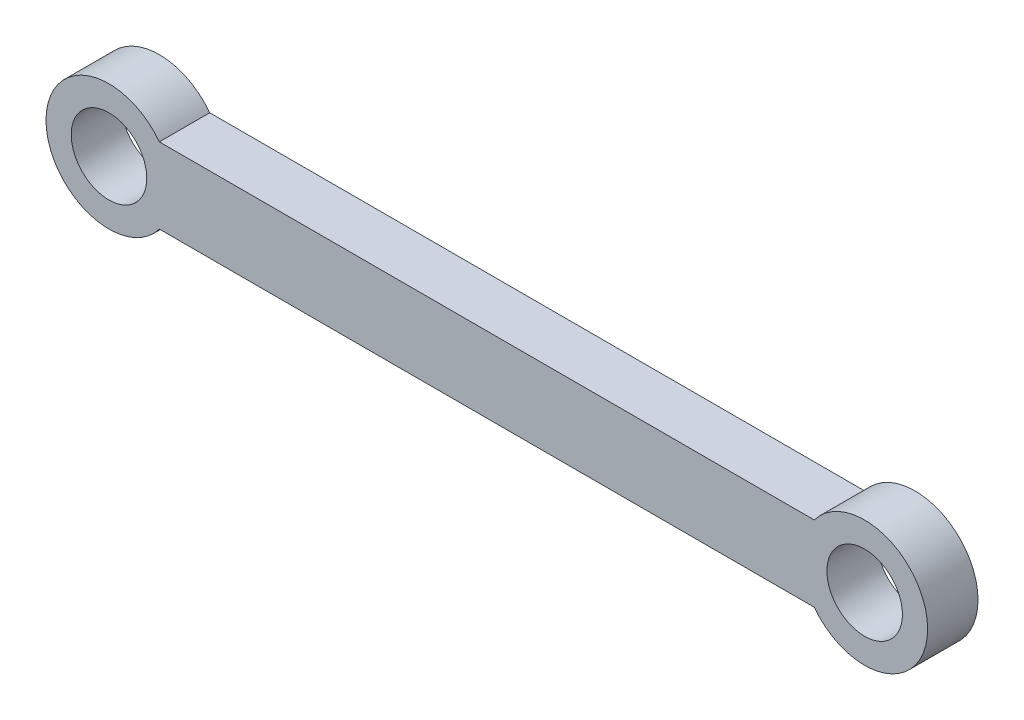
ISO-10303-21;
HEADER;
FILE_DESCRIPTION(('STEP AP214'),'2;1');
FILE_NAME('part.step','',(''),(''),'','','');
FILE_SCHEMA(('AUTOMOTIVE_DESIGN { 1 0 10303 214 1 1 1 1 }'));
ENDSEC;
DATA;
#1=APPLICATION_CONTEXT('core data for automotive mechanical design processes');
#2=APPLICATION_PROTOCOL_DEFINITION('international standard','automotive_design',2000,#1);
#3=PRODUCT_CONTEXT('',#1,'mechanical');
#4=PRODUCT('Part','Part','',(#3));
#5=PRODUCT_RELATED_PRODUCT_CATEGORY('part','',(#4));
#6=PRODUCT_DEFINITION_FORMATION('','',#4);
#7=PRODUCT_DEFINITION_CONTEXT('part definition',#1,'design');
#8=PRODUCT_DEFINITION('design','',#6,#7);
#9=PRODUCT_DEFINITION_SHAPE('','',#8);
#10=(LENGTH_UNIT() NAMED_UNIT(*) SI_UNIT(.MILLI.,.METRE.));
#11=(NAMED_UNIT(*) PLANE_ANGLE_UNIT() SI_UNIT($,.RADIAN.));
#12=(NAMED_UNIT(*) SI_UNIT($,.STERADIAN.) SOLID_ANGLE_UNIT());
#13=UNCERTAINTY_MEASURE_WITH_UNIT(LENGTH_MEASURE(1.E-05),#10,'distance_accuracy_value','');
#14=(GEOMETRIC_REPRESENTATION_CONTEXT(3) GLOBAL_UNCERTAINTY_ASSIGNED_CONTEXT((#13)) GLOBAL_UNIT_ASSIGNED_CONTEXT((#10,
#11,#12)) REPRESENTATION_CONTEXT('',''));
#15=CARTESIAN_POINT('',(0.,0.,0.));
#16=DIRECTION('',(0.,0.,1.));
#17=DIRECTION('',(1.,0.,0.));
#18=AXIS2_PLACEMENT_3D('',#15,#16,#17);
#19=CARTESIAN_POINT('',(-15.,0.,2.));
#20=DIRECTION('',(0.,0.,1.));
#21=DIRECTION('',(1.,0.,0.));
#22=AXIS2_PLACEMENT_3D('',#19,#20,#21);
#23=PLANE('',#22);
#24=CARTESIAN_POINT('',(-15.,0.,2.));
#25=DIRECTION('',(0.,0.,1.));
#26=DIRECTION('',(1.,0.,0.));
#27=AXIS2_PLACEMENT_3D('',#24,#25,#26);
#28=CIRCLE('',#27,1.5);
#29=CARTESIAN_POINT('',(-13.5,0.,2.));
#30=VERTEX_POINT('',#29);
#31=EDGE_CURVE('E101',#30,#30,#28,.T.);
#32=ORIENTED_EDGE('',*,*,#31,.F.);
#33=EDGE_LOOP('',(#32));
#34=FACE_BOUND('',#33,.T.);
#35=CARTESIAN_POINT('',(-15.,0.,2.));
#36=DIRECTION('',(0.,0.,1.));
#37=DIRECTION('',(1.,0.,0.));
#38=AXIS2_PLACEMENT_3D('',#35,#36,#37);
#39=CIRCLE('',#38,2.5);
#40=CARTESIAN_POINT('',(-13.,1.5,2.));
#41=VERTEX_POINT('',#40);
#42=CARTESIAN_POINT('',(-13.,-1.5,2.));
#43=VERTEX_POINT('',#42);
#44=EDGE_CURVE('E86',#41,#43,#39,.T.);
#45=ORIENTED_EDGE('',*,*,#44,.T.);
#46=DIRECTION('',(1.,0.,0.));
#47=VECTOR('',#46,1.);
#48=CARTESIAN_POINT('',(-13.,-1.5,2.));
#49=LINE('',#48,#47);
#50=CARTESIAN_POINT('',(13.,-1.5,2.));
#51=VERTEX_POINT('',#50);
#52=EDGE_CURVE('E81',#43,#51,#49,.T.);
#53=ORIENTED_EDGE('',*,*,#52,.T.);
#54=CARTESIAN_POINT('',(15.,0.,2.));
#55=DIRECTION('',(0.,0.,1.));
#56=DIRECTION('',(1.,0.,0.));
#57=AXIS2_PLACEMENT_3D('',#54,#55,#56);
#58=CIRCLE('',#57,2.5);
#59=CARTESIAN_POINT('',(13.,1.5,2.));
#60=VERTEX_POINT('',#59);
#61=EDGE_CURVE('E84',#51,#60,#58,.T.);
#62=ORIENTED_EDGE('',*,*,#61,.T.);
#63=DIRECTION('',(-1.,0.,0.));
#64=VECTOR('',#63,1.);
#65=CARTESIAN_POINT('',(-13.,1.5,2.));
#66=LINE('',#65,#64);
#67=EDGE_CURVE('E51',#60,#41,#66,.T.);
#68=ORIENTED_EDGE('',*,*,#67,.T.);
#69=EDGE_LOOP('',(#45,#53,#62,#68));
#70=FACE_BOUND('',#69,.T.);
#71=CARTESIAN_POINT('',(15.,0.,2.));
#72=DIRECTION('',(0.,0.,1.));
#73=DIRECTION('',(1.,0.,0.));
#74=AXIS2_PLACEMENT_3D('',#71,#72,#73);
#75=CIRCLE('',#74,1.5);
#76=CARTESIAN_POINT('',(16.5,0.,2.));
#77=VERTEX_POINT('',#76);
#78=EDGE_CURVE('E116',#77,#77,#75,.T.);
#79=ORIENTED_EDGE('',*,*,#78,.F.);
#80=EDGE_LOOP('',(#79));
#81=FACE_BOUND('',#80,.T.);
#82=ADVANCED_FACE('F34',(#34,#70,#81),#23,.T.);
#83=CARTESIAN_POINT('',(-15.,0.,0.));
#84=DIRECTION('',(0.,0.,1.));
#85=DIRECTION('',(1.,0.,0.));
#86=AXIS2_PLACEMENT_3D('',#83,#84,#85);
#87=PLANE('',#86);
#88=CARTESIAN_POINT('',(-15.,0.,0.));
#89=DIRECTION('',(0.,0.,1.));
#90=DIRECTION('',(1.,0.,0.));
#91=AXIS2_PLACEMENT_3D('',#88,#89,#90);
#92=CIRCLE('',#91,2.5);
#93=CARTESIAN_POINT('',(-13.,1.5,0.));
#94=VERTEX_POINT('',#93);
#95=CARTESIAN_POINT('',(-13.,-1.5,0.));
#96=VERTEX_POINT('',#95);
#97=EDGE_CURVE('E98',#94,#96,#92,.T.);
#98=ORIENTED_EDGE('',*,*,#97,.F.);
#99=DIRECTION('',(-1.,0.,0.));
#100=VECTOR('',#99,1.);
#101=CARTESIAN_POINT('',(-13.,1.5,0.));
#102=LINE('',#101,#100);
#103=CARTESIAN_POINT('',(13.,1.5,0.));
#104=VERTEX_POINT('',#103);
#105=EDGE_CURVE('E74',#104,#94,#102,.T.);
#106=ORIENTED_EDGE('',*,*,#105,.F.);
#107=CARTESIAN_POINT('',(15.,0.,0.));
#108=DIRECTION('',(0.,0.,1.));
#109=DIRECTION('',(1.,0.,0.));
#110=AXIS2_PLACEMENT_3D('',#107,#108,#109);
#111=CIRCLE('',#110,2.5);
#112=CARTESIAN_POINT('',(13.,-1.5,0.));
#113=VERTEX_POINT('',#112);
#114=EDGE_CURVE('E68',#113,#104,#111,.T.);
#115=ORIENTED_EDGE('',*,*,#114,.F.);
#116=DIRECTION('',(1.,0.,0.));
#117=VECTOR('',#116,1.);
#118=CARTESIAN_POINT('',(-13.,-1.5,0.));
#119=LINE('',#118,#117);
#120=EDGE_CURVE('E90',#96,#113,#119,.T.);
#121=ORIENTED_EDGE('',*,*,#120,.F.);
#122=EDGE_LOOP('',(#98,#106,#115,#121));
#123=FACE_BOUND('',#122,.T.);
#124=CARTESIAN_POINT('',(-15.,0.,0.));
#125=DIRECTION('',(0.,0.,1.));
#126=DIRECTION('',(1.,0.,0.));
#127=AXIS2_PLACEMENT_3D('',#124,#125,#126);
#128=CIRCLE('',#127,1.5);
#129=CARTESIAN_POINT('',(-13.5,0.,0.));
#130=VERTEX_POINT('',#129);
#131=EDGE_CURVE('E113',#130,#130,#128,.T.);
#132=ORIENTED_EDGE('',*,*,#131,.T.);
#133=EDGE_LOOP('',(#132));
#134=FACE_BOUND('',#133,.T.);
#135=CARTESIAN_POINT('',(15.,0.,0.));
#136=DIRECTION('',(0.,0.,1.));
#137=DIRECTION('',(1.,0.,0.));
#138=AXIS2_PLACEMENT_3D('',#135,#136,#137);
#139=CIRCLE('',#138,1.5);
#140=CARTESIAN_POINT('',(16.5,0.,0.));
#141=VERTEX_POINT('',#140);
#142=EDGE_CURVE('E119',#141,#141,#139,.T.);
#143=ORIENTED_EDGE('',*,*,#142,.T.);
#144=EDGE_LOOP('',(#143));
#145=FACE_BOUND('',#144,.T.);
#146=ADVANCED_FACE('F109',(#123,#134,#145),#87,.F.);
#147=CARTESIAN_POINT('',(-15.,0.,2.));
#148=DIRECTION('',(0.,0.,-1.));
#149=DIRECTION('',(-1.,0.,0.));
#150=AXIS2_PLACEMENT_3D('',#147,#148,#149);
#151=CYLINDRICAL_SURFACE('',#150,2.5);
#152=ORIENTED_EDGE('',*,*,#97,.T.);
#153=DIRECTION('',(0.,0.,-1.));
#154=VECTOR('',#153,1.);
#155=CARTESIAN_POINT('',(-13.,-1.5,2.));
#156=LINE('',#155,#154);
#157=EDGE_CURVE('E11',#43,#96,#156,.T.);
#158=ORIENTED_EDGE('',*,*,#157,.F.);
#159=ORIENTED_EDGE('',*,*,#44,.F.);
#160=DIRECTION('',(0.,0.,-1.));
#161=VECTOR('',#160,1.);
#162=CARTESIAN_POINT('',(-13.,1.5,2.));
#163=LINE('',#162,#161);
#164=EDGE_CURVE('E94',#41,#94,#163,.T.);
#165=ORIENTED_EDGE('',*,*,#164,.T.);
#166=EDGE_LOOP('',(#152,#158,#159,#165));
#167=FACE_BOUND('',#166,.T.);
#168=ADVANCED_FACE('F36',(#167),#151,.T.);
#169=CARTESIAN_POINT('',(-13.,-1.5,2.));
#170=DIRECTION('',(0.,1.,0.));
#171=DIRECTION('',(-1.,0.,0.));
#172=AXIS2_PLACEMENT_3D('',#169,#170,#171);
#173=PLANE('',#172);
#174=ORIENTED_EDGE('',*,*,#120,.T.);
#175=DIRECTION('',(0.,0.,-1.));
#176=VECTOR('',#175,1.);
#177=CARTESIAN_POINT('',(13.,-1.5,2.));
#178=LINE('',#177,#176);
#179=EDGE_CURVE('E43',#51,#113,#178,.T.);
#180=ORIENTED_EDGE('',*,*,#179,.F.);
#181=ORIENTED_EDGE('',*,*,#52,.F.);
#182=ORIENTED_EDGE('',*,*,#157,.T.);
#183=EDGE_LOOP('',(#174,#180,#181,#182));
#184=FACE_BOUND('',#183,.T.);
#185=ADVANCED_FACE('F89',(#184),#173,.F.);
#186=CARTESIAN_POINT('',(15.,0.,2.));
#187=DIRECTION('',(0.,0.,-1.));
#188=DIRECTION('',(-1.,0.,0.));
#189=AXIS2_PLACEMENT_3D('',#186,#187,#188);
#190=CYLINDRICAL_SURFACE('',#189,2.5);
#191=ORIENTED_EDGE('',*,*,#114,.T.);
#192=DIRECTION('',(0.,0.,-1.));
#193=VECTOR('',#192,1.);
#194=CARTESIAN_POINT('',(13.,1.5,2.));
#195=LINE('',#194,#193);
#196=EDGE_CURVE('E91',#60,#104,#195,.T.);
#197=ORIENTED_EDGE('',*,*,#196,.F.);
#198=ORIENTED_EDGE('',*,*,#61,.F.);
#199=ORIENTED_EDGE('',*,*,#179,.T.);
#200=EDGE_LOOP('',(#191,#197,#198,#199));
#201=FACE_BOUND('',#200,.T.);
#202=ADVANCED_FACE('F92',(#201),#190,.T.);
#203=CARTESIAN_POINT('',(-13.,1.5,2.));
#204=DIRECTION('',(0.,-1.,0.));
#205=DIRECTION('',(1.,0.,0.));
#206=AXIS2_PLACEMENT_3D('',#203,#204,#205);
#207=PLANE('',#206);
#208=ORIENTED_EDGE('',*,*,#105,.T.);
#209=ORIENTED_EDGE('',*,*,#164,.F.);
#210=ORIENTED_EDGE('',*,*,#67,.F.);
#211=ORIENTED_EDGE('',*,*,#196,.T.);
#212=EDGE_LOOP('',(#208,#209,#210,#211));
#213=FACE_BOUND('',#212,.T.);
#214=ADVANCED_FACE('F106',(#213),#207,.F.);
#215=CARTESIAN_POINT('',(-15.,0.,2.));
#216=DIRECTION('',(0.,0.,-1.));
#217=DIRECTION('',(-1.,0.,0.));
#218=AXIS2_PLACEMENT_3D('',#215,#216,#217);
#219=CYLINDRICAL_SURFACE('',#218,1.5);
#220=ORIENTED_EDGE('',*,*,#31,.T.);
#221=EDGE_LOOP('',(#220));
#222=FACE_BOUND('',#221,.T.);
#223=ORIENTED_EDGE('',*,*,#131,.F.);
#224=EDGE_LOOP('',(#223));
#225=FACE_BOUND('',#224,.T.);
#226=ADVANCED_FACE('F136',(#222,#225),#219,.F.);
#227=CARTESIAN_POINT('',(15.,0.,2.));
#228=DIRECTION('',(0.,0.,-1.));
#229=DIRECTION('',(-1.,0.,0.));
#230=AXIS2_PLACEMENT_3D('',#227,#228,#229);
#231=CYLINDRICAL_SURFACE('',#230,1.5);
#232=ORIENTED_EDGE('',*,*,#78,.T.);
#233=EDGE_LOOP('',(#232));
#234=FACE_BOUND('',#233,.T.);
#235=ORIENTED_EDGE('',*,*,#142,.F.);
#236=EDGE_LOOP('',(#235));
#237=FACE_BOUND('',#236,.T.);
#238=ADVANCED_FACE('F125',(#234,#237),#231,.F.);
#239=CLOSED_SHELL('',(#82,#146,#168,#185,#202,#214,#226,#238));
#240=MANIFOLD_SOLID_BREP('B2',#239);
#241=ADVANCED_BREP_SHAPE_REPRESENTATION('',(#18,#240),#14);
#242=SHAPE_DEFINITION_REPRESENTATION(#9,#241);
ENDSEC;
END-ISO-10303-21;
